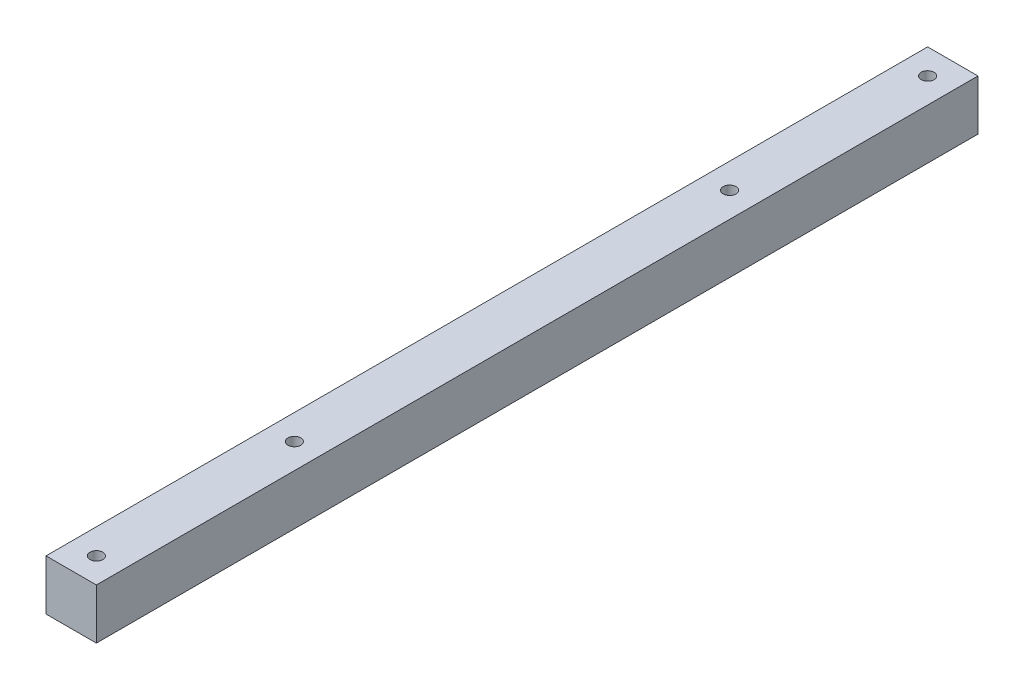
ISO-10303-21;
HEADER;
FILE_DESCRIPTION(('STEP AP214'),'2;1');
FILE_NAME('part.step','',(''),(''),'','','');
FILE_SCHEMA(('AUTOMOTIVE_DESIGN { 1 0 10303 214 1 1 1 1 }'));
ENDSEC;
DATA;
#1=APPLICATION_CONTEXT('core data for automotive mechanical design processes');
#2=APPLICATION_PROTOCOL_DEFINITION('international standard','automotive_design',2000,#1);
#3=PRODUCT_CONTEXT('',#1,'mechanical');
#4=PRODUCT('Part','Part','',(#3));
#5=PRODUCT_RELATED_PRODUCT_CATEGORY('part','',(#4));
#6=PRODUCT_DEFINITION_FORMATION('','',#4);
#7=PRODUCT_DEFINITION_CONTEXT('part definition',#1,'design');
#8=PRODUCT_DEFINITION('design','',#6,#7);
#9=PRODUCT_DEFINITION_SHAPE('','',#8);
#10=(LENGTH_UNIT() NAMED_UNIT(*) SI_UNIT(.MILLI.,.METRE.));
#11=(NAMED_UNIT(*) PLANE_ANGLE_UNIT() SI_UNIT($,.RADIAN.));
#12=(NAMED_UNIT(*) SI_UNIT($,.STERADIAN.) SOLID_ANGLE_UNIT());
#13=UNCERTAINTY_MEASURE_WITH_UNIT(LENGTH_MEASURE(1.E-05),#10,'distance_accuracy_value','');
#14=(GEOMETRIC_REPRESENTATION_CONTEXT(3) GLOBAL_UNCERTAINTY_ASSIGNED_CONTEXT((#13)) GLOBAL_UNIT_ASSIGNED_CONTEXT((#10,
#11,#12)) REPRESENTATION_CONTEXT('',''));
#15=CARTESIAN_POINT('',(0.,0.,0.));
#16=DIRECTION('',(0.,0.,1.));
#17=DIRECTION('',(1.,0.,0.));
#18=AXIS2_PLACEMENT_3D('',#15,#16,#17);
#19=CARTESIAN_POINT('',(0.,0.,350.));
#20=DIRECTION('',(1.,0.,0.));
#21=DIRECTION('',(0.,0.,-1.));
#22=AXIS2_PLACEMENT_3D('',#19,#20,#21);
#23=PLANE('',#22);
#24=DIRECTION('',(0.,-1.,0.));
#25=VECTOR('',#24,1.);
#26=CARTESIAN_POINT('',(0.,0.,0.));
#27=LINE('',#26,#25);
#28=CARTESIAN_POINT('',(0.,0.,0.));
#29=VERTEX_POINT('',#28);
#30=CARTESIAN_POINT('',(0.,-20.,0.));
#31=VERTEX_POINT('',#30);
#32=EDGE_CURVE('E96',#29,#31,#27,.T.);
#33=ORIENTED_EDGE('',*,*,#32,.T.);
#34=DIRECTION('',(0.,0.,-1.));
#35=VECTOR('',#34,1.);
#36=CARTESIAN_POINT('',(0.,-20.,350.));
#37=LINE('',#36,#35);
#38=CARTESIAN_POINT('',(0.,-20.,350.));
#39=VERTEX_POINT('',#38);
#40=EDGE_CURVE('E11',#39,#31,#37,.T.);
#41=ORIENTED_EDGE('',*,*,#40,.F.);
#42=DIRECTION('',(0.,-1.,0.));
#43=VECTOR('',#42,1.);
#44=CARTESIAN_POINT('',(0.,0.,350.));
#45=LINE('',#44,#43);
#46=CARTESIAN_POINT('',(0.,0.,350.));
#47=VERTEX_POINT('',#46);
#48=EDGE_CURVE('E84',#47,#39,#45,.T.);
#49=ORIENTED_EDGE('',*,*,#48,.F.);
#50=DIRECTION('',(0.,0.,-1.));
#51=VECTOR('',#50,1.);
#52=CARTESIAN_POINT('',(0.,0.,350.));
#53=LINE('',#52,#51);
#54=EDGE_CURVE('E92',#47,#29,#53,.T.);
#55=ORIENTED_EDGE('',*,*,#54,.T.);
#56=EDGE_LOOP('',(#33,#41,#49,#55));
#57=FACE_BOUND('',#56,.T.);
#58=ADVANCED_FACE('F33',(#57),#23,.F.);
#59=CARTESIAN_POINT('',(0.,-20.,350.));
#60=DIRECTION('',(0.,1.,0.));
#61=DIRECTION('',(0.,0.,1.));
#62=AXIS2_PLACEMENT_3D('',#59,#60,#61);
#63=PLANE('',#62);
#64=CARTESIAN_POINT('',(10.,-20.,10.));
#65=DIRECTION('',(0.,1.,0.));
#66=DIRECTION('',(0.,0.,1.));
#67=AXIS2_PLACEMENT_3D('',#64,#65,#66);
#68=CIRCLE('',#67,2.55);
#69=CARTESIAN_POINT('',(10.,-20.,12.55));
#70=VERTEX_POINT('',#69);
#71=EDGE_CURVE('E115',#70,#70,#68,.T.);
#72=ORIENTED_EDGE('',*,*,#71,.T.);
#73=EDGE_LOOP('',(#72));
#74=FACE_BOUND('',#73,.T.);
#75=CARTESIAN_POINT('',(10.,-20.,261.4));
#76=DIRECTION('',(0.,1.,0.));
#77=DIRECTION('',(0.,0.,1.));
#78=AXIS2_PLACEMENT_3D('',#75,#76,#77);
#79=CIRCLE('',#78,2.55000000000003);
#80=CARTESIAN_POINT('',(10.,-20.,263.95));
#81=VERTEX_POINT('',#80);
#82=EDGE_CURVE('E118',#81,#81,#79,.T.);
#83=ORIENTED_EDGE('',*,*,#82,.T.);
#84=EDGE_LOOP('',(#83));
#85=FACE_BOUND('',#84,.T.);
#86=CARTESIAN_POINT('',(10.,-20.,88.6));
#87=DIRECTION('',(0.,1.,0.));
#88=DIRECTION('',(0.,0.,1.));
#89=AXIS2_PLACEMENT_3D('',#86,#87,#88);
#90=CIRCLE('',#89,2.55);
#91=CARTESIAN_POINT('',(10.,-20.,91.15));
#92=VERTEX_POINT('',#91);
#93=EDGE_CURVE('E121',#92,#92,#90,.T.);
#94=ORIENTED_EDGE('',*,*,#93,.T.);
#95=EDGE_LOOP('',(#94));
#96=FACE_BOUND('',#95,.T.);
#97=CARTESIAN_POINT('',(10.,-20.,340.));
#98=DIRECTION('',(0.,1.,0.));
#99=DIRECTION('',(0.,0.,1.));
#100=AXIS2_PLACEMENT_3D('',#97,#98,#99);
#101=CIRCLE('',#100,2.55000000000002);
#102=CARTESIAN_POINT('',(10.,-20.,342.55));
#103=VERTEX_POINT('',#102);
#104=EDGE_CURVE('E99',#103,#103,#101,.T.);
#105=ORIENTED_EDGE('',*,*,#104,.T.);
#106=EDGE_LOOP('',(#105));
#107=FACE_BOUND('',#106,.T.);
#108=DIRECTION('',(1.,0.,0.));
#109=VECTOR('',#108,1.);
#110=CARTESIAN_POINT('',(0.,-20.,0.));
#111=LINE('',#110,#109);
#112=CARTESIAN_POINT('',(20.,-20.,0.));
#113=VERTEX_POINT('',#112);
#114=EDGE_CURVE('E88',#31,#113,#111,.T.);
#115=ORIENTED_EDGE('',*,*,#114,.T.);
#116=DIRECTION('',(0.,0.,-1.));
#117=VECTOR('',#116,1.);
#118=CARTESIAN_POINT('',(20.,-20.,350.));
#119=LINE('',#118,#117);
#120=CARTESIAN_POINT('',(20.,-20.,350.));
#121=VERTEX_POINT('',#120);
#122=EDGE_CURVE('E41',#121,#113,#119,.T.);
#123=ORIENTED_EDGE('',*,*,#122,.F.);
#124=DIRECTION('',(1.,0.,0.));
#125=VECTOR('',#124,1.);
#126=CARTESIAN_POINT('',(0.,-20.,350.));
#127=LINE('',#126,#125);
#128=EDGE_CURVE('E79',#39,#121,#127,.T.);
#129=ORIENTED_EDGE('',*,*,#128,.F.);
#130=ORIENTED_EDGE('',*,*,#40,.T.);
#131=EDGE_LOOP('',(#115,#123,#129,#130));
#132=FACE_BOUND('',#131,.T.);
#133=ADVANCED_FACE('F87',(#74,#85,#96,#107,#132),#63,.F.);
#134=CARTESIAN_POINT('',(20.,0.,350.));
#135=DIRECTION('',(-1.,0.,0.));
#136=DIRECTION('',(0.,0.,1.));
#137=AXIS2_PLACEMENT_3D('',#134,#135,#136);
#138=PLANE('',#137);
#139=DIRECTION('',(0.,1.,0.));
#140=VECTOR('',#139,1.);
#141=CARTESIAN_POINT('',(20.,0.,0.));
#142=LINE('',#141,#140);
#143=CARTESIAN_POINT('',(20.,0.,0.));
#144=VERTEX_POINT('',#143);
#145=EDGE_CURVE('E66',#113,#144,#142,.T.);
#146=ORIENTED_EDGE('',*,*,#145,.T.);
#147=DIRECTION('',(0.,0.,-1.));
#148=VECTOR('',#147,1.);
#149=CARTESIAN_POINT('',(20.,0.,350.));
#150=LINE('',#149,#148);
#151=CARTESIAN_POINT('',(20.,0.,350.));
#152=VERTEX_POINT('',#151);
#153=EDGE_CURVE('E89',#152,#144,#150,.T.);
#154=ORIENTED_EDGE('',*,*,#153,.F.);
#155=DIRECTION('',(0.,1.,0.));
#156=VECTOR('',#155,1.);
#157=CARTESIAN_POINT('',(20.,0.,350.));
#158=LINE('',#157,#156);
#159=EDGE_CURVE('E82',#121,#152,#158,.T.);
#160=ORIENTED_EDGE('',*,*,#159,.F.);
#161=ORIENTED_EDGE('',*,*,#122,.T.);
#162=EDGE_LOOP('',(#146,#154,#160,#161));
#163=FACE_BOUND('',#162,.T.);
#164=ADVANCED_FACE('F90',(#163),#138,.F.);
#165=CARTESIAN_POINT('',(0.,0.,350.));
#166=DIRECTION('',(0.,-1.,0.));
#167=DIRECTION('',(0.,0.,-1.));
#168=AXIS2_PLACEMENT_3D('',#165,#166,#167);
#169=PLANE('',#168);
#170=CARTESIAN_POINT('',(10.,0.,10.));
#171=DIRECTION('',(0.,1.,0.));
#172=DIRECTION('',(0.,0.,1.));
#173=AXIS2_PLACEMENT_3D('',#170,#171,#172);
#174=CIRCLE('',#173,2.55);
#175=CARTESIAN_POINT('',(10.,0.,12.55));
#176=VERTEX_POINT('',#175);
#177=EDGE_CURVE('E124',#176,#176,#174,.T.);
#178=ORIENTED_EDGE('',*,*,#177,.F.);
#179=EDGE_LOOP('',(#178));
#180=FACE_BOUND('',#179,.T.);
#181=CARTESIAN_POINT('',(10.,0.,261.4));
#182=DIRECTION('',(0.,1.,0.));
#183=DIRECTION('',(0.,0.,1.));
#184=AXIS2_PLACEMENT_3D('',#181,#182,#183);
#185=CIRCLE('',#184,2.55000000000003);
#186=CARTESIAN_POINT('',(10.,0.,263.95));
#187=VERTEX_POINT('',#186);
#188=EDGE_CURVE('E128',#187,#187,#185,.T.);
#189=ORIENTED_EDGE('',*,*,#188,.F.);
#190=EDGE_LOOP('',(#189));
#191=FACE_BOUND('',#190,.T.);
#192=CARTESIAN_POINT('',(10.,0.,88.6));
#193=DIRECTION('',(0.,1.,0.));
#194=DIRECTION('',(0.,0.,1.));
#195=AXIS2_PLACEMENT_3D('',#192,#193,#194);
#196=CIRCLE('',#195,2.55);
#197=CARTESIAN_POINT('',(10.,0.,91.15));
#198=VERTEX_POINT('',#197);
#199=EDGE_CURVE('E125',#198,#198,#196,.T.);
#200=ORIENTED_EDGE('',*,*,#199,.F.);
#201=EDGE_LOOP('',(#200));
#202=FACE_BOUND('',#201,.T.);
#203=CARTESIAN_POINT('',(10.,0.,340.));
#204=DIRECTION('',(0.,1.,0.));
#205=DIRECTION('',(0.,0.,1.));
#206=AXIS2_PLACEMENT_3D('',#203,#204,#205);
#207=CIRCLE('',#206,2.55000000000002);
#208=CARTESIAN_POINT('',(10.,0.,342.55));
#209=VERTEX_POINT('',#208);
#210=EDGE_CURVE('E112',#209,#209,#207,.T.);
#211=ORIENTED_EDGE('',*,*,#210,.F.);
#212=EDGE_LOOP('',(#211));
#213=FACE_BOUND('',#212,.T.);
#214=DIRECTION('',(-1.,0.,0.));
#215=VECTOR('',#214,1.);
#216=CARTESIAN_POINT('',(0.,0.,0.));
#217=LINE('',#216,#215);
#218=EDGE_CURVE('E72',#144,#29,#217,.T.);
#219=ORIENTED_EDGE('',*,*,#218,.T.);
#220=ORIENTED_EDGE('',*,*,#54,.F.);
#221=DIRECTION('',(-1.,0.,0.));
#222=VECTOR('',#221,1.);
#223=CARTESIAN_POINT('',(0.,0.,350.));
#224=LINE('',#223,#222);
#225=EDGE_CURVE('E49',#152,#47,#224,.T.);
#226=ORIENTED_EDGE('',*,*,#225,.F.);
#227=ORIENTED_EDGE('',*,*,#153,.T.);
#228=EDGE_LOOP('',(#219,#220,#226,#227));
#229=FACE_BOUND('',#228,.T.);
#230=ADVANCED_FACE('F104',(#180,#191,#202,#213,#229),#169,.F.);
#231=CARTESIAN_POINT('',(0.,0.,350.));
#232=DIRECTION('',(0.,0.,1.));
#233=DIRECTION('',(1.,0.,0.));
#234=AXIS2_PLACEMENT_3D('',#231,#232,#233);
#235=PLANE('',#234);
#236=ORIENTED_EDGE('',*,*,#48,.T.);
#237=ORIENTED_EDGE('',*,*,#128,.T.);
#238=ORIENTED_EDGE('',*,*,#159,.T.);
#239=ORIENTED_EDGE('',*,*,#225,.T.);
#240=EDGE_LOOP('',(#236,#237,#238,#239));
#241=FACE_BOUND('',#240,.T.);
#242=ADVANCED_FACE('F80',(#241),#235,.T.);
#243=CARTESIAN_POINT('',(0.,0.,0.));
#244=DIRECTION('',(0.,0.,1.));
#245=DIRECTION('',(1.,0.,0.));
#246=AXIS2_PLACEMENT_3D('',#243,#244,#245);
#247=PLANE('',#246);
#248=ORIENTED_EDGE('',*,*,#32,.F.);
#249=ORIENTED_EDGE('',*,*,#218,.F.);
#250=ORIENTED_EDGE('',*,*,#145,.F.);
#251=ORIENTED_EDGE('',*,*,#114,.F.);
#252=EDGE_LOOP('',(#248,#249,#250,#251));
#253=FACE_BOUND('',#252,.T.);
#254=ADVANCED_FACE('F107',(#253),#247,.F.);
#255=CARTESIAN_POINT('',(10.,-79.,340.));
#256=DIRECTION('',(0.,1.,0.));
#257=DIRECTION('',(0.,0.,1.));
#258=AXIS2_PLACEMENT_3D('',#255,#256,#257);
#259=CYLINDRICAL_SURFACE('',#258,2.55000000000002);
#260=CARTESIAN_POINT('',(10.,0.,342.55));
#261=CARTESIAN_POINT('',(10.,-0.208333333333334,342.55));
#262=CARTESIAN_POINT('',(10.,-0.416666666666667,342.55));
#263=CARTESIAN_POINT('',(10.,-0.833333333333334,342.55));
#264=CARTESIAN_POINT('',(10.,-1.04166666666667,342.55));
#265=CARTESIAN_POINT('',(10.,-1.45833333333333,342.55));
#266=CARTESIAN_POINT('',(10.,-1.66666666666667,342.55));
#267=CARTESIAN_POINT('',(10.,-2.08333333333334,342.55));
#268=CARTESIAN_POINT('',(10.,-2.29166666666667,342.55));
#269=CARTESIAN_POINT('',(10.,-2.70833333333334,342.55));
#270=CARTESIAN_POINT('',(10.,-2.91666666666667,342.55));
#271=CARTESIAN_POINT('',(10.,-3.33333333333334,342.55));
#272=CARTESIAN_POINT('',(10.,-3.54166666666667,342.55));
#273=CARTESIAN_POINT('',(10.,-3.95833333333334,342.55));
#274=CARTESIAN_POINT('',(10.,-4.16666666666667,342.55));
#275=CARTESIAN_POINT('',(10.,-4.58333333333334,342.55));
#276=CARTESIAN_POINT('',(10.,-4.79166666666667,342.55));
#277=CARTESIAN_POINT('',(10.,-5.20833333333334,342.55));
#278=CARTESIAN_POINT('',(10.,-5.41666666666667,342.55));
#279=CARTESIAN_POINT('',(10.,-5.83333333333334,342.55));
#280=CARTESIAN_POINT('',(10.,-6.04166666666667,342.55));
#281=CARTESIAN_POINT('',(10.,-6.45833333333334,342.55));
#282=CARTESIAN_POINT('',(10.,-6.66666666666667,342.55));
#283=CARTESIAN_POINT('',(10.,-7.08333333333334,342.55));
#284=CARTESIAN_POINT('',(10.,-7.29166666666667,342.55));
#285=CARTESIAN_POINT('',(10.,-7.70833333333334,342.55));
#286=CARTESIAN_POINT('',(10.,-7.91666666666667,342.55));
#287=CARTESIAN_POINT('',(10.,-8.33333333333334,342.55));
#288=CARTESIAN_POINT('',(10.,-8.54166666666667,342.55));
#289=CARTESIAN_POINT('',(10.,-8.95833333333334,342.55));
#290=CARTESIAN_POINT('',(10.,-9.16666666666667,342.55));
#291=CARTESIAN_POINT('',(10.,-9.58333333333334,342.55));
#292=CARTESIAN_POINT('',(10.,-9.79166666666668,342.55));
#293=CARTESIAN_POINT('',(10.,-10.2083333333333,342.55));
#294=CARTESIAN_POINT('',(10.,-10.4166666666667,342.55));
#295=CARTESIAN_POINT('',(10.,-10.8333333333333,342.55));
#296=CARTESIAN_POINT('',(10.,-11.0416666666667,342.55));
#297=CARTESIAN_POINT('',(10.,-11.4583333333333,342.55));
#298=CARTESIAN_POINT('',(10.,-11.6666666666667,342.55));
#299=CARTESIAN_POINT('',(10.,-12.0833333333333,342.55));
#300=CARTESIAN_POINT('',(10.,-12.2916666666667,342.55));
#301=CARTESIAN_POINT('',(10.,-12.7083333333333,342.55));
#302=CARTESIAN_POINT('',(10.,-12.9166666666667,342.55));
#303=CARTESIAN_POINT('',(10.,-13.3333333333333,342.55));
#304=CARTESIAN_POINT('',(10.,-13.5416666666667,342.55));
#305=CARTESIAN_POINT('',(10.,-13.9583333333333,342.55));
#306=CARTESIAN_POINT('',(10.,-14.1666666666667,342.55));
#307=CARTESIAN_POINT('',(10.,-14.5833333333333,342.55));
#308=CARTESIAN_POINT('',(10.,-14.7916666666667,342.55));
#309=CARTESIAN_POINT('',(10.,-15.2083333333333,342.55));
#310=CARTESIAN_POINT('',(10.,-15.4166666666667,342.55));
#311=CARTESIAN_POINT('',(10.,-15.8333333333333,342.55));
#312=CARTESIAN_POINT('',(10.,-16.0416666666667,342.55));
#313=CARTESIAN_POINT('',(10.,-16.4583333333333,342.55));
#314=CARTESIAN_POINT('',(10.,-16.6666666666667,342.55));
#315=CARTESIAN_POINT('',(10.,-17.0833333333333,342.55));
#316=CARTESIAN_POINT('',(10.,-17.2916666666667,342.55));
#317=CARTESIAN_POINT('',(10.,-17.7083333333333,342.55));
#318=CARTESIAN_POINT('',(10.,-17.9166666666667,342.55));
#319=CARTESIAN_POINT('',(10.,-18.3333333333333,342.55));
#320=CARTESIAN_POINT('',(10.,-18.5416666666667,342.55));
#321=CARTESIAN_POINT('',(10.,-18.9583333333333,342.55));
#322=CARTESIAN_POINT('',(10.,-19.1666666666667,342.55));
#323=CARTESIAN_POINT('',(10.,-19.5833333333333,342.55));
#324=CARTESIAN_POINT('',(10.,-19.7916666666667,342.55));
#325=CARTESIAN_POINT('',(10.,-20.,342.55));
#326=B_SPLINE_CURVE_WITH_KNOTS('',3,(#260,#261,#262,#263,#264,#265,#266,#267,#268,#269,#270,
#271,#272,#273,#274,#275,#276,#277,#278,#279,#280,#281,#282,#283,#284,#285,#286,#287,#288,#289,
#290,#291,#292,#293,#294,#295,#296,#297,#298,#299,#300,#301,#302,#303,#304,#305,#306,#307,#308,
#309,#310,#311,#312,#313,#314,#315,#316,#317,#318,#319,#320,#321,#322,#323,#324,#325),
.UNSPECIFIED.,.F.,.F.,(4,2,2,2,2,2,2,2,2,2,2,2,2,2,2,2,2,2,2,2,2,2,2,2,2,2,2,2,2,2,2,2,4),(0.,
0.625000000000001,1.25,1.875,2.5,3.125,3.75,4.375,5.,5.62500000000001,6.25000000000001,
6.87500000000001,7.50000000000001,8.12500000000001,8.75000000000001,9.37500000000001,10.,10.625,
11.25,11.875,12.5,13.125,13.75,14.375,15.,15.625,16.25,16.875,17.5,18.125,18.75,19.375,20.),.UNSPECIFIED.);
#327=EDGE_CURVE('BSEAM146',#209,#103,#326,.T.);
#328=ORIENTED_EDGE('',*,*,#210,.T.);
#329=ORIENTED_EDGE('',*,*,#104,.F.);
#330=ORIENTED_EDGE('',*,*,#327,.T.);
#331=ORIENTED_EDGE('',*,*,#327,.F.);
#332=EDGE_LOOP('',(#328,#330,#329,#331));
#333=FACE_BOUND('',#332,.T.);
#334=ADVANCED_FACE('F146',(#333),#259,.F.);
#335=CARTESIAN_POINT('',(10.,-79.,88.6));
#336=DIRECTION('',(0.,1.,0.));
#337=DIRECTION('',(0.,0.,1.));
#338=AXIS2_PLACEMENT_3D('',#335,#336,#337);
#339=CYLINDRICAL_SURFACE('',#338,2.55);
#340=CARTESIAN_POINT('',(10.,0.,91.15));
#341=CARTESIAN_POINT('',(10.,-0.208333333333334,91.15));
#342=CARTESIAN_POINT('',(10.,-0.416666666666667,91.15));
#343=CARTESIAN_POINT('',(10.,-0.833333333333334,91.15));
#344=CARTESIAN_POINT('',(10.,-1.04166666666667,91.15));
#345=CARTESIAN_POINT('',(10.,-1.45833333333333,91.15));
#346=CARTESIAN_POINT('',(10.,-1.66666666666667,91.15));
#347=CARTESIAN_POINT('',(10.,-2.08333333333334,91.15));
#348=CARTESIAN_POINT('',(10.,-2.29166666666667,91.15));
#349=CARTESIAN_POINT('',(10.,-2.70833333333334,91.15));
#350=CARTESIAN_POINT('',(10.,-2.91666666666667,91.15));
#351=CARTESIAN_POINT('',(10.,-3.33333333333334,91.15));
#352=CARTESIAN_POINT('',(10.,-3.54166666666667,91.15));
#353=CARTESIAN_POINT('',(10.,-3.95833333333334,91.15));
#354=CARTESIAN_POINT('',(10.,-4.16666666666667,91.15));
#355=CARTESIAN_POINT('',(10.,-4.58333333333334,91.15));
#356=CARTESIAN_POINT('',(10.,-4.79166666666667,91.15));
#357=CARTESIAN_POINT('',(10.,-5.20833333333334,91.15));
#358=CARTESIAN_POINT('',(10.,-5.41666666666667,91.15));
#359=CARTESIAN_POINT('',(10.,-5.83333333333334,91.15));
#360=CARTESIAN_POINT('',(10.,-6.04166666666667,91.15));
#361=CARTESIAN_POINT('',(10.,-6.45833333333334,91.15));
#362=CARTESIAN_POINT('',(10.,-6.66666666666667,91.15));
#363=CARTESIAN_POINT('',(10.,-7.08333333333334,91.15));
#364=CARTESIAN_POINT('',(10.,-7.29166666666667,91.15));
#365=CARTESIAN_POINT('',(10.,-7.70833333333334,91.15));
#366=CARTESIAN_POINT('',(10.,-7.91666666666667,91.15));
#367=CARTESIAN_POINT('',(10.,-8.33333333333334,91.15));
#368=CARTESIAN_POINT('',(10.,-8.54166666666667,91.15));
#369=CARTESIAN_POINT('',(10.,-8.95833333333334,91.15));
#370=CARTESIAN_POINT('',(10.,-9.16666666666667,91.15));
#371=CARTESIAN_POINT('',(10.,-9.58333333333334,91.15));
#372=CARTESIAN_POINT('',(10.,-9.79166666666668,91.15));
#373=CARTESIAN_POINT('',(10.,-10.2083333333333,91.15));
#374=CARTESIAN_POINT('',(10.,-10.4166666666667,91.15));
#375=CARTESIAN_POINT('',(10.,-10.8333333333333,91.15));
#376=CARTESIAN_POINT('',(10.,-11.0416666666667,91.15));
#377=CARTESIAN_POINT('',(10.,-11.4583333333333,91.15));
#378=CARTESIAN_POINT('',(10.,-11.6666666666667,91.15));
#379=CARTESIAN_POINT('',(10.,-12.0833333333333,91.15));
#380=CARTESIAN_POINT('',(10.,-12.2916666666667,91.15));
#381=CARTESIAN_POINT('',(10.,-12.7083333333333,91.15));
#382=CARTESIAN_POINT('',(10.,-12.9166666666667,91.15));
#383=CARTESIAN_POINT('',(10.,-13.3333333333333,91.15));
#384=CARTESIAN_POINT('',(10.,-13.5416666666667,91.15));
#385=CARTESIAN_POINT('',(10.,-13.9583333333333,91.15));
#386=CARTESIAN_POINT('',(10.,-14.1666666666667,91.15));
#387=CARTESIAN_POINT('',(10.,-14.5833333333333,91.15));
#388=CARTESIAN_POINT('',(10.,-14.7916666666667,91.15));
#389=CARTESIAN_POINT('',(10.,-15.2083333333333,91.15));
#390=CARTESIAN_POINT('',(10.,-15.4166666666667,91.15));
#391=CARTESIAN_POINT('',(10.,-15.8333333333333,91.15));
#392=CARTESIAN_POINT('',(10.,-16.0416666666667,91.15));
#393=CARTESIAN_POINT('',(10.,-16.4583333333333,91.15));
#394=CARTESIAN_POINT('',(10.,-16.6666666666667,91.15));
#395=CARTESIAN_POINT('',(10.,-17.0833333333333,91.15));
#396=CARTESIAN_POINT('',(10.,-17.2916666666667,91.15));
#397=CARTESIAN_POINT('',(10.,-17.7083333333333,91.15));
#398=CARTESIAN_POINT('',(10.,-17.9166666666667,91.15));
#399=CARTESIAN_POINT('',(10.,-18.3333333333333,91.15));
#400=CARTESIAN_POINT('',(10.,-18.5416666666667,91.15));
#401=CARTESIAN_POINT('',(10.,-18.9583333333333,91.15));
#402=CARTESIAN_POINT('',(10.,-19.1666666666667,91.15));
#403=CARTESIAN_POINT('',(10.,-19.5833333333333,91.15));
#404=CARTESIAN_POINT('',(10.,-19.7916666666667,91.15));
#405=CARTESIAN_POINT('',(10.,-20.,91.15));
#406=B_SPLINE_CURVE_WITH_KNOTS('',3,(#340,#341,#342,#343,#344,#345,#346,#347,#348,#349,#350,
#351,#352,#353,#354,#355,#356,#357,#358,#359,#360,#361,#362,#363,#364,#365,#366,#367,#368,#369,
#370,#371,#372,#373,#374,#375,#376,#377,#378,#379,#380,#381,#382,#383,#384,#385,#386,#387,#388,
#389,#390,#391,#392,#393,#394,#395,#396,#397,#398,#399,#400,#401,#402,#403,#404,#405),
.UNSPECIFIED.,.F.,.F.,(4,2,2,2,2,2,2,2,2,2,2,2,2,2,2,2,2,2,2,2,2,2,2,2,2,2,2,2,2,2,2,2,4),(0.,
0.625000000000001,1.25,1.875,2.5,3.125,3.75,4.375,5.,5.62500000000001,6.25000000000001,
6.87500000000001,7.50000000000001,8.12500000000001,8.75000000000001,9.37500000000001,10.,10.625,
11.25,11.875,12.5,13.125,13.75,14.375,15.,15.625,16.25,16.875,17.5,18.125,18.75,19.375,20.),.UNSPECIFIED.);
#407=EDGE_CURVE('BSEAM149',#198,#92,#406,.T.);
#408=ORIENTED_EDGE('',*,*,#199,.T.);
#409=ORIENTED_EDGE('',*,*,#93,.F.);
#410=ORIENTED_EDGE('',*,*,#407,.T.);
#411=ORIENTED_EDGE('',*,*,#407,.F.);
#412=EDGE_LOOP('',(#408,#410,#409,#411));
#413=FACE_BOUND('',#412,.T.);
#414=ADVANCED_FACE('F149',(#413),#339,.F.);
#415=CARTESIAN_POINT('',(10.,-79.,261.4));
#416=DIRECTION('',(0.,1.,0.));
#417=DIRECTION('',(0.,0.,1.));
#418=AXIS2_PLACEMENT_3D('',#415,#416,#417);
#419=CYLINDRICAL_SURFACE('',#418,2.55000000000003);
#420=CARTESIAN_POINT('',(10.,0.,263.95));
#421=CARTESIAN_POINT('',(10.,-0.208333333333334,263.95));
#422=CARTESIAN_POINT('',(10.,-0.416666666666667,263.95));
#423=CARTESIAN_POINT('',(10.,-0.833333333333334,263.95));
#424=CARTESIAN_POINT('',(10.,-1.04166666666667,263.95));
#425=CARTESIAN_POINT('',(10.,-1.45833333333333,263.95));
#426=CARTESIAN_POINT('',(10.,-1.66666666666667,263.95));
#427=CARTESIAN_POINT('',(10.,-2.08333333333334,263.95));
#428=CARTESIAN_POINT('',(10.,-2.29166666666667,263.95));
#429=CARTESIAN_POINT('',(10.,-2.70833333333334,263.95));
#430=CARTESIAN_POINT('',(10.,-2.91666666666667,263.95));
#431=CARTESIAN_POINT('',(10.,-3.33333333333334,263.95));
#432=CARTESIAN_POINT('',(10.,-3.54166666666667,263.95));
#433=CARTESIAN_POINT('',(10.,-3.95833333333334,263.95));
#434=CARTESIAN_POINT('',(10.,-4.16666666666667,263.95));
#435=CARTESIAN_POINT('',(10.,-4.58333333333334,263.95));
#436=CARTESIAN_POINT('',(10.,-4.79166666666667,263.95));
#437=CARTESIAN_POINT('',(10.,-5.20833333333334,263.95));
#438=CARTESIAN_POINT('',(10.,-5.41666666666667,263.95));
#439=CARTESIAN_POINT('',(10.,-5.83333333333334,263.95));
#440=CARTESIAN_POINT('',(10.,-6.04166666666667,263.95));
#441=CARTESIAN_POINT('',(10.,-6.45833333333334,263.95));
#442=CARTESIAN_POINT('',(10.,-6.66666666666667,263.95));
#443=CARTESIAN_POINT('',(10.,-7.08333333333334,263.95));
#444=CARTESIAN_POINT('',(10.,-7.29166666666667,263.95));
#445=CARTESIAN_POINT('',(10.,-7.70833333333334,263.95));
#446=CARTESIAN_POINT('',(10.,-7.91666666666667,263.95));
#447=CARTESIAN_POINT('',(10.,-8.33333333333334,263.95));
#448=CARTESIAN_POINT('',(10.,-8.54166666666667,263.95));
#449=CARTESIAN_POINT('',(10.,-8.95833333333334,263.95));
#450=CARTESIAN_POINT('',(10.,-9.16666666666667,263.95));
#451=CARTESIAN_POINT('',(10.,-9.58333333333334,263.95));
#452=CARTESIAN_POINT('',(10.,-9.79166666666668,263.95));
#453=CARTESIAN_POINT('',(10.,-10.2083333333333,263.95));
#454=CARTESIAN_POINT('',(10.,-10.4166666666667,263.95));
#455=CARTESIAN_POINT('',(10.,-10.8333333333333,263.95));
#456=CARTESIAN_POINT('',(10.,-11.0416666666667,263.95));
#457=CARTESIAN_POINT('',(10.,-11.4583333333333,263.95));
#458=CARTESIAN_POINT('',(10.,-11.6666666666667,263.95));
#459=CARTESIAN_POINT('',(10.,-12.0833333333333,263.95));
#460=CARTESIAN_POINT('',(10.,-12.2916666666667,263.95));
#461=CARTESIAN_POINT('',(10.,-12.7083333333333,263.95));
#462=CARTESIAN_POINT('',(10.,-12.9166666666667,263.95));
#463=CARTESIAN_POINT('',(10.,-13.3333333333333,263.95));
#464=CARTESIAN_POINT('',(10.,-13.5416666666667,263.95));
#465=CARTESIAN_POINT('',(10.,-13.9583333333333,263.95));
#466=CARTESIAN_POINT('',(10.,-14.1666666666667,263.95));
#467=CARTESIAN_POINT('',(10.,-14.5833333333333,263.95));
#468=CARTESIAN_POINT('',(10.,-14.7916666666667,263.95));
#469=CARTESIAN_POINT('',(10.,-15.2083333333333,263.95));
#470=CARTESIAN_POINT('',(10.,-15.4166666666667,263.95));
#471=CARTESIAN_POINT('',(10.,-15.8333333333333,263.95));
#472=CARTESIAN_POINT('',(10.,-16.0416666666667,263.95));
#473=CARTESIAN_POINT('',(10.,-16.4583333333333,263.95));
#474=CARTESIAN_POINT('',(10.,-16.6666666666667,263.95));
#475=CARTESIAN_POINT('',(10.,-17.0833333333333,263.95));
#476=CARTESIAN_POINT('',(10.,-17.2916666666667,263.95));
#477=CARTESIAN_POINT('',(10.,-17.7083333333333,263.95));
#478=CARTESIAN_POINT('',(10.,-17.9166666666667,263.95));
#479=CARTESIAN_POINT('',(10.,-18.3333333333333,263.95));
#480=CARTESIAN_POINT('',(10.,-18.5416666666667,263.95));
#481=CARTESIAN_POINT('',(10.,-18.9583333333333,263.95));
#482=CARTESIAN_POINT('',(10.,-19.1666666666667,263.95));
#483=CARTESIAN_POINT('',(10.,-19.5833333333333,263.95));
#484=CARTESIAN_POINT('',(10.,-19.7916666666667,263.95));
#485=CARTESIAN_POINT('',(10.,-20.,263.95));
#486=B_SPLINE_CURVE_WITH_KNOTS('',3,(#420,#421,#422,#423,#424,#425,#426,#427,#428,#429,#430,
#431,#432,#433,#434,#435,#436,#437,#438,#439,#440,#441,#442,#443,#444,#445,#446,#447,#448,#449,
#450,#451,#452,#453,#454,#455,#456,#457,#458,#459,#460,#461,#462,#463,#464,#465,#466,#467,#468,
#469,#470,#471,#472,#473,#474,#475,#476,#477,#478,#479,#480,#481,#482,#483,#484,#485),
.UNSPECIFIED.,.F.,.F.,(4,2,2,2,2,2,2,2,2,2,2,2,2,2,2,2,2,2,2,2,2,2,2,2,2,2,2,2,2,2,2,2,4),(0.,
0.625000000000001,1.25,1.875,2.5,3.125,3.75,4.375,5.,5.62500000000001,6.25000000000001,
6.87500000000001,7.50000000000001,8.12500000000001,8.75000000000001,9.37500000000001,10.,10.625,
11.25,11.875,12.5,13.125,13.75,14.375,15.,15.625,16.25,16.875,17.5,18.125,18.75,19.375,20.),.UNSPECIFIED.);
#487=EDGE_CURVE('BSEAM168',#187,#81,#486,.T.);
#488=ORIENTED_EDGE('',*,*,#188,.T.);
#489=ORIENTED_EDGE('',*,*,#82,.F.);
#490=ORIENTED_EDGE('',*,*,#487,.T.);
#491=ORIENTED_EDGE('',*,*,#487,.F.);
#492=EDGE_LOOP('',(#488,#490,#489,#491));
#493=FACE_BOUND('',#492,.T.);
#494=ADVANCED_FACE('F168',(#493),#419,.F.);
#495=CARTESIAN_POINT('',(10.,-79.,10.));
#496=DIRECTION('',(0.,1.,0.));
#497=DIRECTION('',(0.,0.,1.));
#498=AXIS2_PLACEMENT_3D('',#495,#496,#497);
#499=CYLINDRICAL_SURFACE('',#498,2.55);
#500=CARTESIAN_POINT('',(10.,0.,12.55));
#501=CARTESIAN_POINT('',(10.,-0.208333333333334,12.55));
#502=CARTESIAN_POINT('',(10.,-0.416666666666667,12.55));
#503=CARTESIAN_POINT('',(10.,-0.833333333333334,12.55));
#504=CARTESIAN_POINT('',(10.,-1.04166666666667,12.55));
#505=CARTESIAN_POINT('',(10.,-1.45833333333333,12.55));
#506=CARTESIAN_POINT('',(10.,-1.66666666666667,12.55));
#507=CARTESIAN_POINT('',(10.,-2.08333333333334,12.55));
#508=CARTESIAN_POINT('',(10.,-2.29166666666667,12.55));
#509=CARTESIAN_POINT('',(10.,-2.70833333333334,12.55));
#510=CARTESIAN_POINT('',(10.,-2.91666666666667,12.55));
#511=CARTESIAN_POINT('',(10.,-3.33333333333334,12.55));
#512=CARTESIAN_POINT('',(10.,-3.54166666666667,12.55));
#513=CARTESIAN_POINT('',(10.,-3.95833333333334,12.55));
#514=CARTESIAN_POINT('',(10.,-4.16666666666667,12.55));
#515=CARTESIAN_POINT('',(10.,-4.58333333333334,12.55));
#516=CARTESIAN_POINT('',(10.,-4.79166666666667,12.55));
#517=CARTESIAN_POINT('',(10.,-5.20833333333334,12.55));
#518=CARTESIAN_POINT('',(10.,-5.41666666666667,12.55));
#519=CARTESIAN_POINT('',(10.,-5.83333333333334,12.55));
#520=CARTESIAN_POINT('',(10.,-6.04166666666667,12.55));
#521=CARTESIAN_POINT('',(10.,-6.45833333333334,12.55));
#522=CARTESIAN_POINT('',(10.,-6.66666666666667,12.55));
#523=CARTESIAN_POINT('',(10.,-7.08333333333334,12.55));
#524=CARTESIAN_POINT('',(10.,-7.29166666666667,12.55));
#525=CARTESIAN_POINT('',(10.,-7.70833333333334,12.55));
#526=CARTESIAN_POINT('',(10.,-7.91666666666667,12.55));
#527=CARTESIAN_POINT('',(10.,-8.33333333333334,12.55));
#528=CARTESIAN_POINT('',(10.,-8.54166666666667,12.55));
#529=CARTESIAN_POINT('',(10.,-8.95833333333334,12.55));
#530=CARTESIAN_POINT('',(10.,-9.16666666666667,12.55));
#531=CARTESIAN_POINT('',(10.,-9.58333333333334,12.55));
#532=CARTESIAN_POINT('',(10.,-9.79166666666668,12.55));
#533=CARTESIAN_POINT('',(10.,-10.2083333333333,12.55));
#534=CARTESIAN_POINT('',(10.,-10.4166666666667,12.55));
#535=CARTESIAN_POINT('',(10.,-10.8333333333333,12.55));
#536=CARTESIAN_POINT('',(10.,-11.0416666666667,12.55));
#537=CARTESIAN_POINT('',(10.,-11.4583333333333,12.55));
#538=CARTESIAN_POINT('',(10.,-11.6666666666667,12.55));
#539=CARTESIAN_POINT('',(10.,-12.0833333333333,12.55));
#540=CARTESIAN_POINT('',(10.,-12.2916666666667,12.55));
#541=CARTESIAN_POINT('',(10.,-12.7083333333333,12.55));
#542=CARTESIAN_POINT('',(10.,-12.9166666666667,12.55));
#543=CARTESIAN_POINT('',(10.,-13.3333333333333,12.55));
#544=CARTESIAN_POINT('',(10.,-13.5416666666667,12.55));
#545=CARTESIAN_POINT('',(10.,-13.9583333333333,12.55));
#546=CARTESIAN_POINT('',(10.,-14.1666666666667,12.55));
#547=CARTESIAN_POINT('',(10.,-14.5833333333333,12.55));
#548=CARTESIAN_POINT('',(10.,-14.7916666666667,12.55));
#549=CARTESIAN_POINT('',(10.,-15.2083333333333,12.55));
#550=CARTESIAN_POINT('',(10.,-15.4166666666667,12.55));
#551=CARTESIAN_POINT('',(10.,-15.8333333333333,12.55));
#552=CARTESIAN_POINT('',(10.,-16.0416666666667,12.55));
#553=CARTESIAN_POINT('',(10.,-16.4583333333333,12.55));
#554=CARTESIAN_POINT('',(10.,-16.6666666666667,12.55));
#555=CARTESIAN_POINT('',(10.,-17.0833333333333,12.55));
#556=CARTESIAN_POINT('',(10.,-17.2916666666667,12.55));
#557=CARTESIAN_POINT('',(10.,-17.7083333333333,12.55));
#558=CARTESIAN_POINT('',(10.,-17.9166666666667,12.55));
#559=CARTESIAN_POINT('',(10.,-18.3333333333333,12.55));
#560=CARTESIAN_POINT('',(10.,-18.5416666666667,12.55));
#561=CARTESIAN_POINT('',(10.,-18.9583333333333,12.55));
#562=CARTESIAN_POINT('',(10.,-19.1666666666667,12.55));
#563=CARTESIAN_POINT('',(10.,-19.5833333333333,12.55));
#564=CARTESIAN_POINT('',(10.,-19.7916666666667,12.55));
#565=CARTESIAN_POINT('',(10.,-20.,12.55));
#566=B_SPLINE_CURVE_WITH_KNOTS('',3,(#500,#501,#502,#503,#504,#505,#506,#507,#508,#509,#510,
#511,#512,#513,#514,#515,#516,#517,#518,#519,#520,#521,#522,#523,#524,#525,#526,#527,#528,#529,
#530,#531,#532,#533,#534,#535,#536,#537,#538,#539,#540,#541,#542,#543,#544,#545,#546,#547,#548,
#549,#550,#551,#552,#553,#554,#555,#556,#557,#558,#559,#560,#561,#562,#563,#564,#565),
.UNSPECIFIED.,.F.,.F.,(4,2,2,2,2,2,2,2,2,2,2,2,2,2,2,2,2,2,2,2,2,2,2,2,2,2,2,2,2,2,2,2,4),(0.,
0.625000000000001,1.25,1.875,2.5,3.125,3.75,4.375,5.,5.62500000000001,6.25000000000001,
6.87500000000001,7.50000000000001,8.12500000000001,8.75000000000001,9.37500000000001,10.,10.625,
11.25,11.875,12.5,13.125,13.75,14.375,15.,15.625,16.25,16.875,17.5,18.125,18.75,19.375,20.),.UNSPECIFIED.);
#567=EDGE_CURVE('BSEAM134',#176,#70,#566,.T.);
#568=ORIENTED_EDGE('',*,*,#177,.T.);
#569=ORIENTED_EDGE('',*,*,#71,.F.);
#570=ORIENTED_EDGE('',*,*,#567,.T.);
#571=ORIENTED_EDGE('',*,*,#567,.F.);
#572=EDGE_LOOP('',(#568,#570,#569,#571));
#573=FACE_BOUND('',#572,.T.);
#574=ADVANCED_FACE('F134',(#573),#499,.F.);
#575=CLOSED_SHELL('',(#58,#133,#164,#230,#242,#254,#334,#414,#494,#574));
#576=MANIFOLD_SOLID_BREP('B2',#575);
#577=ADVANCED_BREP_SHAPE_REPRESENTATION('',(#18,#576),#14);
#578=SHAPE_DEFINITION_REPRESENTATION(#9,#577);
ENDSEC;
END-ISO-10303-21;
